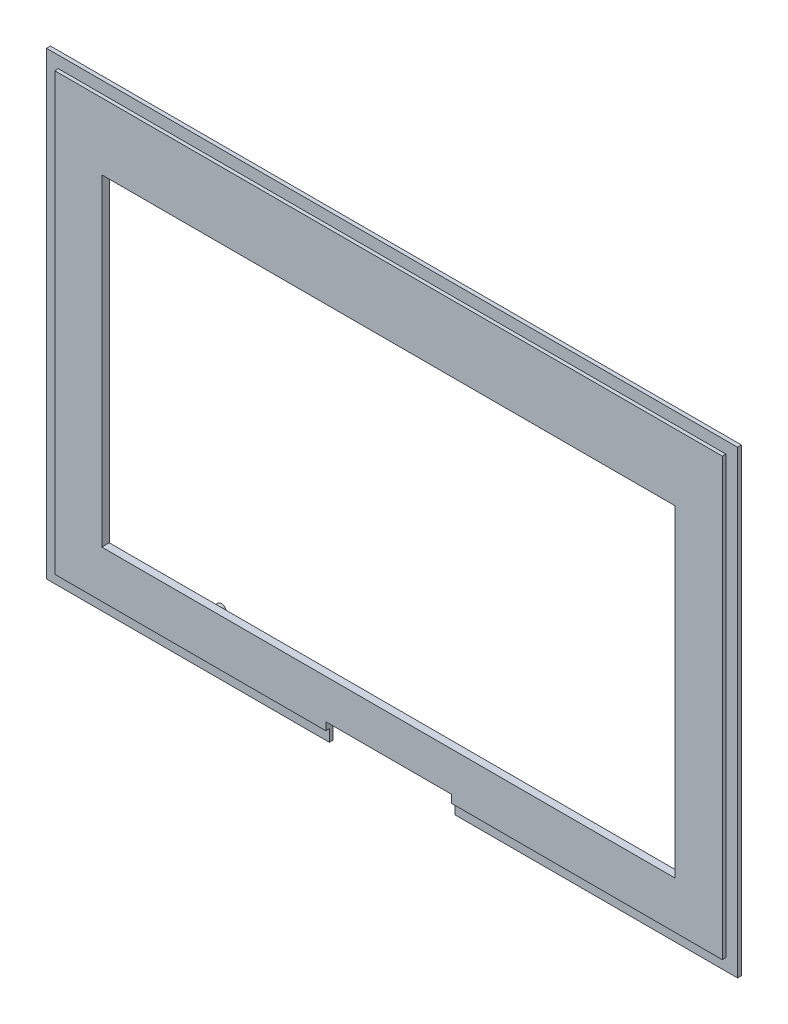
ISO-10303-21;
HEADER;
FILE_DESCRIPTION(('STEP AP214'),'2;1');
FILE_NAME('part.step','',(''),(''),'','','');
FILE_SCHEMA(('AUTOMOTIVE_DESIGN { 1 0 10303 214 1 1 1 1 }'));
ENDSEC;
DATA;
#1=APPLICATION_CONTEXT('core data for automotive mechanical design processes');
#2=APPLICATION_PROTOCOL_DEFINITION('international standard','automotive_design',2000,#1);
#3=PRODUCT_CONTEXT('',#1,'mechanical');
#4=PRODUCT('Part','Part','',(#3));
#5=PRODUCT_RELATED_PRODUCT_CATEGORY('part','',(#4));
#6=PRODUCT_DEFINITION_FORMATION('','',#4);
#7=PRODUCT_DEFINITION_CONTEXT('part definition',#1,'design');
#8=PRODUCT_DEFINITION('design','',#6,#7);
#9=PRODUCT_DEFINITION_SHAPE('','',#8);
#10=(LENGTH_UNIT() NAMED_UNIT(*) SI_UNIT(.MILLI.,.METRE.));
#11=(NAMED_UNIT(*) PLANE_ANGLE_UNIT() SI_UNIT($,.RADIAN.));
#12=(NAMED_UNIT(*) SI_UNIT($,.STERADIAN.) SOLID_ANGLE_UNIT());
#13=UNCERTAINTY_MEASURE_WITH_UNIT(LENGTH_MEASURE(1.E-05),#10,'distance_accuracy_value','');
#14=(GEOMETRIC_REPRESENTATION_CONTEXT(3) GLOBAL_UNCERTAINTY_ASSIGNED_CONTEXT((#13)) GLOBAL_UNIT_ASSIGNED_CONTEXT((#10,
#11,#12)) REPRESENTATION_CONTEXT('',''));
#15=CARTESIAN_POINT('',(0.,0.,0.));
#16=DIRECTION('',(0.,0.,1.));
#17=DIRECTION('',(1.,0.,0.));
#18=AXIS2_PLACEMENT_3D('',#15,#16,#17);
#19=CARTESIAN_POINT('',(5.90000000000003,6.99999999999999,0.9));
#20=DIRECTION('',(0.,1.,0.));
#21=DIRECTION('',(0.,0.,1.));
#22=AXIS2_PLACEMENT_3D('',#19,#20,#21);
#23=PLANE('',#22);
#24=DIRECTION('',(1.,0.,0.));
#25=VECTOR('',#24,1.);
#26=CARTESIAN_POINT('',(5.90000000000003,6.99999999999999,0.));
#27=LINE('',#26,#25);
#28=CARTESIAN_POINT('',(5.90000000000003,6.99999999999999,0.));
#29=VERTEX_POINT('',#28);
#30=CARTESIAN_POINT('',(75.,6.99999999999999,0.));
#31=VERTEX_POINT('',#30);
#32=EDGE_CURVE('E357',#29,#31,#27,.T.);
#33=ORIENTED_EDGE('',*,*,#32,.T.);
#34=DIRECTION('',(0.,0.,1.));
#35=VECTOR('',#34,1.);
#36=CARTESIAN_POINT('',(75.,6.99999999999999,0.9));
#37=LINE('',#36,#35);
#38=CARTESIAN_POINT('',(75.,6.99999999999999,0.9));
#39=VERTEX_POINT('',#38);
#40=EDGE_CURVE('E300',#31,#39,#37,.T.);
#41=ORIENTED_EDGE('',*,*,#40,.T.);
#42=DIRECTION('',(1.,0.,0.));
#43=VECTOR('',#42,1.);
#44=CARTESIAN_POINT('',(5.90000000000003,6.99999999999999,0.9));
#45=LINE('',#44,#43);
#46=CARTESIAN_POINT('',(5.90000000000003,6.99999999999999,0.9));
#47=VERTEX_POINT('',#46);
#48=EDGE_CURVE('E346',#47,#39,#45,.T.);
#49=ORIENTED_EDGE('',*,*,#48,.F.);
#50=DIRECTION('',(0.,0.,-1.));
#51=VECTOR('',#50,1.);
#52=CARTESIAN_POINT('',(5.90000000000003,6.99999999999999,0.9));
#53=LINE('',#52,#51);
#54=EDGE_CURVE('E366',#47,#29,#53,.T.);
#55=ORIENTED_EDGE('',*,*,#54,.T.);
#56=EDGE_LOOP('',(#33,#41,#49,#55));
#57=FACE_BOUND('',#56,.T.);
#58=ADVANCED_FACE('F34',(#57),#23,.F.);
#59=CARTESIAN_POINT('',(179.1,3.99999999999999,-1.));
#60=DIRECTION('',(0.,1.,0.));
#61=DIRECTION('',(0.,0.,1.));
#62=AXIS2_PLACEMENT_3D('',#59,#60,#61);
#63=PLANE('',#62);
#64=DIRECTION('',(-1.,0.,0.));
#65=VECTOR('',#64,1.);
#66=CARTESIAN_POINT('',(179.1,3.99999999999999,-1.));
#67=LINE('',#66,#65);
#68=CARTESIAN_POINT('',(75.,3.99999999999999,-0.999999999999994));
#69=VERTEX_POINT('',#68);
#70=CARTESIAN_POINT('',(2.89999999999999,3.99999999999999,-1.));
#71=VERTEX_POINT('',#70);
#72=EDGE_CURVE('E307',#69,#71,#67,.T.);
#73=ORIENTED_EDGE('',*,*,#72,.F.);
#74=DIRECTION('',(0.,0.,-1.));
#75=VECTOR('',#74,1.);
#76=CARTESIAN_POINT('',(75.,3.99999999999999,-0.999999999999994));
#77=LINE('',#76,#75);
#78=CARTESIAN_POINT('',(75.,3.99999999999999,0.));
#79=VERTEX_POINT('',#78);
#80=EDGE_CURVE('E264',#79,#69,#77,.T.);
#81=ORIENTED_EDGE('',*,*,#80,.F.);
#82=DIRECTION('',(-1.,0.,0.));
#83=VECTOR('',#82,1.);
#84=CARTESIAN_POINT('',(179.1,3.99999999999999,0.));
#85=LINE('',#84,#83);
#86=CARTESIAN_POINT('',(2.89999999999999,3.99999999999999,0.));
#87=VERTEX_POINT('',#86);
#88=EDGE_CURVE('E319',#79,#87,#85,.T.);
#89=ORIENTED_EDGE('',*,*,#88,.T.);
#90=DIRECTION('',(0.,0.,1.));
#91=VECTOR('',#90,1.);
#92=CARTESIAN_POINT('',(2.89999999999999,3.99999999999999,-1.));
#93=LINE('',#92,#91);
#94=EDGE_CURVE('E331',#71,#87,#93,.T.);
#95=ORIENTED_EDGE('',*,*,#94,.F.);
#96=EDGE_LOOP('',(#73,#81,#89,#95));
#97=FACE_BOUND('',#96,.T.);
#98=ADVANCED_FACE('F397',(#97),#63,.F.);
#99=CARTESIAN_POINT('',(5.90000000000001,118.2,0.9));
#100=DIRECTION('',(0.,1.,0.));
#101=DIRECTION('',(-1.,0.,0.));
#102=AXIS2_PLACEMENT_3D('',#99,#100,#101);
#103=PLANE('',#102);
#104=DIRECTION('',(1.,0.,0.));
#105=VECTOR('',#104,1.);
#106=CARTESIAN_POINT('',(5.90000000000001,118.2,0.));
#107=LINE('',#106,#105);
#108=CARTESIAN_POINT('',(5.90000000000001,118.2,0.));
#109=VERTEX_POINT('',#108);
#110=CARTESIAN_POINT('',(176.1,118.2,0.));
#111=VERTEX_POINT('',#110);
#112=EDGE_CURVE('E337',#109,#111,#107,.T.);
#113=ORIENTED_EDGE('',*,*,#112,.F.);
#114=DIRECTION('',(0.,0.,-1.));
#115=VECTOR('',#114,1.);
#116=CARTESIAN_POINT('',(5.90000000000001,118.2,0.9));
#117=LINE('',#116,#115);
#118=CARTESIAN_POINT('',(5.90000000000001,118.2,0.9));
#119=VERTEX_POINT('',#118);
#120=EDGE_CURVE('E362',#119,#109,#117,.T.);
#121=ORIENTED_EDGE('',*,*,#120,.F.);
#122=DIRECTION('',(1.,0.,0.));
#123=VECTOR('',#122,1.);
#124=CARTESIAN_POINT('',(5.90000000000001,118.2,0.9));
#125=LINE('',#124,#123);
#126=CARTESIAN_POINT('',(176.1,118.2,0.9));
#127=VERTEX_POINT('',#126);
#128=EDGE_CURVE('E338',#119,#127,#125,.T.);
#129=ORIENTED_EDGE('',*,*,#128,.T.);
#130=DIRECTION('',(0.,0.,-1.));
#131=VECTOR('',#130,1.);
#132=CARTESIAN_POINT('',(176.1,118.2,0.9));
#133=LINE('',#132,#131);
#134=EDGE_CURVE('E351',#127,#111,#133,.T.);
#135=ORIENTED_EDGE('',*,*,#134,.T.);
#136=EDGE_LOOP('',(#113,#121,#129,#135));
#137=FACE_BOUND('',#136,.T.);
#138=ADVANCED_FACE('F36',(#137),#103,.T.);
#139=CARTESIAN_POINT('',(5.90000000000001,118.2,0.9));
#140=DIRECTION('',(1.,0.,0.));
#141=DIRECTION('',(0.,1.,0.));
#142=AXIS2_PLACEMENT_3D('',#139,#140,#141);
#143=PLANE('',#142);
#144=DIRECTION('',(0.,-1.,0.));
#145=VECTOR('',#144,1.);
#146=CARTESIAN_POINT('',(5.90000000000001,118.2,0.));
#147=LINE('',#146,#145);
#148=EDGE_CURVE('E342',#109,#29,#147,.T.);
#149=ORIENTED_EDGE('',*,*,#148,.T.);
#150=ORIENTED_EDGE('',*,*,#54,.F.);
#151=DIRECTION('',(0.,-1.,0.));
#152=VECTOR('',#151,1.);
#153=CARTESIAN_POINT('',(5.90000000000001,118.2,0.9));
#154=LINE('',#153,#152);
#155=EDGE_CURVE('E349',#119,#47,#154,.T.);
#156=ORIENTED_EDGE('',*,*,#155,.F.);
#157=ORIENTED_EDGE('',*,*,#120,.T.);
#158=EDGE_LOOP('',(#149,#150,#156,#157));
#159=FACE_BOUND('',#158,.T.);
#160=ADVANCED_FACE('F410',(#159),#143,.F.);
#161=CARTESIAN_POINT('',(107.,6.99999999999999,0.900000000000006));
#162=VERTEX_POINT('',#161);
#163=CARTESIAN_POINT('',(176.1,6.99999999999999,0.9));
#164=VERTEX_POINT('',#163);
#165=EDGE_CURVE('E345',#162,#164,#45,.T.);
#166=ORIENTED_EDGE('',*,*,#165,.F.);
#167=DIRECTION('',(0.,0.,-1.));
#168=VECTOR('',#167,1.);
#169=CARTESIAN_POINT('',(107.,6.99999999999999,0.9));
#170=LINE('',#169,#168);
#171=CARTESIAN_POINT('',(107.,6.99999999999999,0.));
#172=VERTEX_POINT('',#171);
#173=EDGE_CURVE('E294',#162,#172,#170,.T.);
#174=ORIENTED_EDGE('',*,*,#173,.T.);
#175=CARTESIAN_POINT('',(176.1,6.99999999999999,0.));
#176=VERTEX_POINT('',#175);
#177=EDGE_CURVE('E356',#172,#176,#27,.T.);
#178=ORIENTED_EDGE('',*,*,#177,.T.);
#179=DIRECTION('',(0.,0.,-1.));
#180=VECTOR('',#179,1.);
#181=CARTESIAN_POINT('',(176.1,6.99999999999999,0.9));
#182=LINE('',#181,#180);
#183=EDGE_CURVE('E369',#164,#176,#182,.T.);
#184=ORIENTED_EDGE('',*,*,#183,.F.);
#185=EDGE_LOOP('',(#166,#174,#178,#184));
#186=FACE_BOUND('',#185,.T.);
#187=ADVANCED_FACE('F400',(#186),#23,.F.);
#188=CARTESIAN_POINT('',(176.1,118.2,0.9));
#189=DIRECTION('',(1.,0.,0.));
#190=DIRECTION('',(0.,0.,-1.));
#191=AXIS2_PLACEMENT_3D('',#188,#189,#190);
#192=PLANE('',#191);
#193=DIRECTION('',(0.,-1.,0.));
#194=VECTOR('',#193,1.);
#195=CARTESIAN_POINT('',(176.1,118.2,0.));
#196=LINE('',#195,#194);
#197=EDGE_CURVE('E353',#111,#176,#196,.T.);
#198=ORIENTED_EDGE('',*,*,#197,.F.);
#199=ORIENTED_EDGE('',*,*,#134,.F.);
#200=DIRECTION('',(0.,-1.,0.));
#201=VECTOR('',#200,1.);
#202=CARTESIAN_POINT('',(176.1,118.2,0.9));
#203=LINE('',#202,#201);
#204=EDGE_CURVE('E341',#127,#164,#203,.T.);
#205=ORIENTED_EDGE('',*,*,#204,.T.);
#206=ORIENTED_EDGE('',*,*,#183,.T.);
#207=EDGE_LOOP('',(#198,#199,#205,#206));
#208=FACE_BOUND('',#207,.T.);
#209=ADVANCED_FACE('F409',(#208),#192,.T.);
#210=CARTESIAN_POINT('',(0.,0.,0.9));
#211=DIRECTION('',(0.,0.,-1.));
#212=DIRECTION('',(-1.,0.,0.));
#213=AXIS2_PLACEMENT_3D('',#210,#211,#212);
#214=PLANE('',#213);
#215=DIRECTION('',(1.,0.,0.));
#216=VECTOR('',#215,1.);
#217=CARTESIAN_POINT('',(17.9,19.,0.9));
#218=LINE('',#217,#216);
#219=CARTESIAN_POINT('',(17.9,19.,0.9));
#220=VERTEX_POINT('',#219);
#221=CARTESIAN_POINT('',(164.1,19.,0.9));
#222=VERTEX_POINT('',#221);
#223=EDGE_CURVE('E194',#220,#222,#218,.T.);
#224=ORIENTED_EDGE('',*,*,#223,.F.);
#225=DIRECTION('',(0.,-1.,0.));
#226=VECTOR('',#225,1.);
#227=CARTESIAN_POINT('',(17.9,101.2,0.9));
#228=LINE('',#227,#226);
#229=CARTESIAN_POINT('',(17.9,101.2,0.9));
#230=VERTEX_POINT('',#229);
#231=EDGE_CURVE('E49',#230,#220,#228,.T.);
#232=ORIENTED_EDGE('',*,*,#231,.F.);
#233=DIRECTION('',(-1.,0.,0.));
#234=VECTOR('',#233,1.);
#235=CARTESIAN_POINT('',(17.9,101.2,0.9));
#236=LINE('',#235,#234);
#237=CARTESIAN_POINT('',(164.1,101.2,0.9));
#238=VERTEX_POINT('',#237);
#239=EDGE_CURVE('E201',#238,#230,#236,.T.);
#240=ORIENTED_EDGE('',*,*,#239,.F.);
#241=DIRECTION('',(0.,1.,0.));
#242=VECTOR('',#241,1.);
#243=CARTESIAN_POINT('',(164.1,101.2,0.9));
#244=LINE('',#243,#242);
#245=EDGE_CURVE('E185',#222,#238,#244,.T.);
#246=ORIENTED_EDGE('',*,*,#245,.F.);
#247=EDGE_LOOP('',(#224,#232,#240,#246));
#248=FACE_BOUND('',#247,.T.);
#249=ORIENTED_EDGE('',*,*,#48,.T.);
#250=DIRECTION('',(0.,-1.,0.));
#251=VECTOR('',#250,1.);
#252=CARTESIAN_POINT('',(75.,8.99999999999999,0.9));
#253=LINE('',#252,#251);
#254=CARTESIAN_POINT('',(75.,8.99999999999999,0.9));
#255=VERTEX_POINT('',#254);
#256=EDGE_CURVE('E282',#255,#39,#253,.T.);
#257=ORIENTED_EDGE('',*,*,#256,.F.);
#258=DIRECTION('',(-1.,0.,0.));
#259=VECTOR('',#258,1.);
#260=CARTESIAN_POINT('',(75.,8.99999999999999,0.9));
#261=LINE('',#260,#259);
#262=CARTESIAN_POINT('',(107.,8.99999999999999,0.900000000000006));
#263=VERTEX_POINT('',#262);
#264=EDGE_CURVE('E276',#263,#255,#261,.T.);
#265=ORIENTED_EDGE('',*,*,#264,.F.);
#266=DIRECTION('',(0.,-1.,0.));
#267=VECTOR('',#266,1.);
#268=CARTESIAN_POINT('',(107.,8.99999999999999,0.900000000000006));
#269=LINE('',#268,#267);
#270=EDGE_CURVE('E285',#263,#162,#269,.T.);
#271=ORIENTED_EDGE('',*,*,#270,.T.);
#272=ORIENTED_EDGE('',*,*,#165,.T.);
#273=ORIENTED_EDGE('',*,*,#204,.F.);
#274=ORIENTED_EDGE('',*,*,#128,.F.);
#275=ORIENTED_EDGE('',*,*,#155,.T.);
#276=EDGE_LOOP('',(#249,#257,#265,#271,#272,#273,#274,#275));
#277=FACE_BOUND('',#276,.T.);
#278=ADVANCED_FACE('F198',(#248,#277),#214,.F.);
#279=CARTESIAN_POINT('',(0.,0.,0.));
#280=DIRECTION('',(0.,0.,-1.));
#281=DIRECTION('',(-1.,0.,0.));
#282=AXIS2_PLACEMENT_3D('',#279,#280,#281);
#283=PLANE('',#282);
#284=ORIENTED_EDGE('',*,*,#88,.F.);
#285=DIRECTION('',(0.,1.,0.));
#286=VECTOR('',#285,1.);
#287=CARTESIAN_POINT('',(75.,0.,0.));
#288=LINE('',#287,#286);
#289=EDGE_CURVE('E297',#79,#31,#288,.T.);
#290=ORIENTED_EDGE('',*,*,#289,.T.);
#291=ORIENTED_EDGE('',*,*,#32,.F.);
#292=ORIENTED_EDGE('',*,*,#148,.F.);
#293=ORIENTED_EDGE('',*,*,#112,.T.);
#294=ORIENTED_EDGE('',*,*,#197,.T.);
#295=ORIENTED_EDGE('',*,*,#177,.F.);
#296=DIRECTION('',(0.,-1.,0.));
#297=VECTOR('',#296,1.);
#298=CARTESIAN_POINT('',(107.,0.,0.));
#299=LINE('',#298,#297);
#300=CARTESIAN_POINT('',(107.,3.99999999999999,0.));
#301=VERTEX_POINT('',#300);
#302=EDGE_CURVE('E284',#172,#301,#299,.T.);
#303=ORIENTED_EDGE('',*,*,#302,.T.);
#304=CARTESIAN_POINT('',(179.1,3.99999999999999,0.));
#305=VERTEX_POINT('',#304);
#306=EDGE_CURVE('E320',#305,#301,#85,.T.);
#307=ORIENTED_EDGE('',*,*,#306,.F.);
#308=DIRECTION('',(0.,-1.,0.));
#309=VECTOR('',#308,1.);
#310=CARTESIAN_POINT('',(179.1,121.2,0.));
#311=LINE('',#310,#309);
#312=CARTESIAN_POINT('',(179.1,121.2,0.));
#313=VERTEX_POINT('',#312);
#314=EDGE_CURVE('E303',#313,#305,#311,.T.);
#315=ORIENTED_EDGE('',*,*,#314,.F.);
#316=DIRECTION('',(1.,0.,0.));
#317=VECTOR('',#316,1.);
#318=CARTESIAN_POINT('',(179.1,121.2,0.));
#319=LINE('',#318,#317);
#320=CARTESIAN_POINT('',(2.90000000000001,121.2,0.));
#321=VERTEX_POINT('',#320);
#322=EDGE_CURVE('E308',#321,#313,#319,.T.);
#323=ORIENTED_EDGE('',*,*,#322,.F.);
#324=DIRECTION('',(0.,1.,0.));
#325=VECTOR('',#324,1.);
#326=CARTESIAN_POINT('',(2.90000000000001,121.2,0.));
#327=LINE('',#326,#325);
#328=EDGE_CURVE('E323',#87,#321,#327,.T.);
#329=ORIENTED_EDGE('',*,*,#328,.F.);
#330=EDGE_LOOP('',(#284,#290,#291,#292,#293,#294,#295,#303,#307,#315,#323,#329));
#331=FACE_BOUND('',#330,.T.);
#332=ADVANCED_FACE('F439',(#331),#283,.F.);
#333=CARTESIAN_POINT('',(179.1,121.2,-1.));
#334=DIRECTION('',(-1.,0.,0.));
#335=DIRECTION('',(0.,-1.,0.));
#336=AXIS2_PLACEMENT_3D('',#333,#334,#335);
#337=PLANE('',#336);
#338=ORIENTED_EDGE('',*,*,#314,.T.);
#339=DIRECTION('',(0.,0.,1.));
#340=VECTOR('',#339,1.);
#341=CARTESIAN_POINT('',(179.1,3.99999999999999,-1.));
#342=LINE('',#341,#340);
#343=CARTESIAN_POINT('',(179.1,3.99999999999999,-1.));
#344=VERTEX_POINT('',#343);
#345=EDGE_CURVE('E334',#344,#305,#342,.T.);
#346=ORIENTED_EDGE('',*,*,#345,.F.);
#347=DIRECTION('',(0.,-1.,0.));
#348=VECTOR('',#347,1.);
#349=CARTESIAN_POINT('',(179.1,121.2,-1.));
#350=LINE('',#349,#348);
#351=CARTESIAN_POINT('',(179.1,121.2,-1.));
#352=VERTEX_POINT('',#351);
#353=EDGE_CURVE('E304',#352,#344,#350,.T.);
#354=ORIENTED_EDGE('',*,*,#353,.F.);
#355=DIRECTION('',(0.,0.,1.));
#356=VECTOR('',#355,1.);
#357=CARTESIAN_POINT('',(179.1,121.2,-1.));
#358=LINE('',#357,#356);
#359=EDGE_CURVE('E316',#352,#313,#358,.T.);
#360=ORIENTED_EDGE('',*,*,#359,.T.);
#361=EDGE_LOOP('',(#338,#346,#354,#360));
#362=FACE_BOUND('',#361,.T.);
#363=ADVANCED_FACE('F463',(#362),#337,.F.);
#364=ORIENTED_EDGE('',*,*,#306,.T.);
#365=DIRECTION('',(0.,0.,1.));
#366=VECTOR('',#365,1.);
#367=CARTESIAN_POINT('',(107.,3.99999999999999,-0.999999999999986));
#368=LINE('',#367,#366);
#369=CARTESIAN_POINT('',(107.,3.99999999999999,-0.999999999999986));
#370=VERTEX_POINT('',#369);
#371=EDGE_CURVE('E270',#370,#301,#368,.T.);
#372=ORIENTED_EDGE('',*,*,#371,.F.);
#373=EDGE_CURVE('E309',#344,#370,#67,.T.);
#374=ORIENTED_EDGE('',*,*,#373,.F.);
#375=ORIENTED_EDGE('',*,*,#345,.T.);
#376=EDGE_LOOP('',(#364,#372,#374,#375));
#377=FACE_BOUND('',#376,.T.);
#378=ADVANCED_FACE('F406',(#377),#63,.F.);
#379=CARTESIAN_POINT('',(2.90000000000001,121.2,-1.));
#380=DIRECTION('',(1.,0.,0.));
#381=DIRECTION('',(0.,1.,0.));
#382=AXIS2_PLACEMENT_3D('',#379,#380,#381);
#383=PLANE('',#382);
#384=ORIENTED_EDGE('',*,*,#328,.T.);
#385=DIRECTION('',(0.,0.,1.));
#386=VECTOR('',#385,1.);
#387=CARTESIAN_POINT('',(2.90000000000001,121.2,-1.));
#388=LINE('',#387,#386);
#389=CARTESIAN_POINT('',(2.90000000000001,121.2,-1.));
#390=VERTEX_POINT('',#389);
#391=EDGE_CURVE('E328',#390,#321,#388,.T.);
#392=ORIENTED_EDGE('',*,*,#391,.F.);
#393=DIRECTION('',(0.,1.,0.));
#394=VECTOR('',#393,1.);
#395=CARTESIAN_POINT('',(2.90000000000001,121.2,-1.));
#396=LINE('',#395,#394);
#397=EDGE_CURVE('E312',#71,#390,#396,.T.);
#398=ORIENTED_EDGE('',*,*,#397,.F.);
#399=ORIENTED_EDGE('',*,*,#94,.T.);
#400=EDGE_LOOP('',(#384,#392,#398,#399));
#401=FACE_BOUND('',#400,.T.);
#402=ADVANCED_FACE('F455',(#401),#383,.F.);
#403=CARTESIAN_POINT('',(179.1,121.2,-1.));
#404=DIRECTION('',(0.,-1.,0.));
#405=DIRECTION('',(0.,0.,-1.));
#406=AXIS2_PLACEMENT_3D('',#403,#404,#405);
#407=PLANE('',#406);
#408=ORIENTED_EDGE('',*,*,#322,.T.);
#409=ORIENTED_EDGE('',*,*,#359,.F.);
#410=DIRECTION('',(1.,0.,0.));
#411=VECTOR('',#410,1.);
#412=CARTESIAN_POINT('',(179.1,121.2,-1.));
#413=LINE('',#412,#411);
#414=EDGE_CURVE('E314',#390,#352,#413,.T.);
#415=ORIENTED_EDGE('',*,*,#414,.F.);
#416=ORIENTED_EDGE('',*,*,#391,.T.);
#417=EDGE_LOOP('',(#408,#409,#415,#416));
#418=FACE_BOUND('',#417,.T.);
#419=ADVANCED_FACE('F461',(#418),#407,.F.);
#420=CARTESIAN_POINT('',(0.,0.,-1.));
#421=DIRECTION('',(0.,0.,-1.));
#422=DIRECTION('',(-1.,0.,0.));
#423=AXIS2_PLACEMENT_3D('',#420,#421,#422);
#424=PLANE('',#423);
#425=DIRECTION('',(0.,1.,0.));
#426=VECTOR('',#425,1.);
#427=CARTESIAN_POINT('',(17.9,0.,-1.));
#428=LINE('',#427,#426);
#429=CARTESIAN_POINT('',(17.9,19.,-1.));
#430=VERTEX_POINT('',#429);
#431=CARTESIAN_POINT('',(17.9,101.2,-1.));
#432=VERTEX_POINT('',#431);
#433=EDGE_CURVE('E11',#430,#432,#428,.T.);
#434=ORIENTED_EDGE('',*,*,#433,.F.);
#435=DIRECTION('',(-1.,0.,0.));
#436=VECTOR('',#435,1.);
#437=CARTESIAN_POINT('',(0.,19.,-1.));
#438=LINE('',#437,#436);
#439=CARTESIAN_POINT('',(164.1,19.,-1.));
#440=VERTEX_POINT('',#439);
#441=EDGE_CURVE('E365',#440,#430,#438,.T.);
#442=ORIENTED_EDGE('',*,*,#441,.F.);
#443=DIRECTION('',(0.,-1.,0.));
#444=VECTOR('',#443,1.);
#445=CARTESIAN_POINT('',(164.1,0.,-1.));
#446=LINE('',#445,#444);
#447=CARTESIAN_POINT('',(164.1,101.2,-1.));
#448=VERTEX_POINT('',#447);
#449=EDGE_CURVE('E188',#448,#440,#446,.T.);
#450=ORIENTED_EDGE('',*,*,#449,.F.);
#451=DIRECTION('',(1.,0.,0.));
#452=VECTOR('',#451,1.);
#453=CARTESIAN_POINT('',(0.,101.2,-1.));
#454=LINE('',#453,#452);
#455=EDGE_CURVE('E42',#432,#448,#454,.T.);
#456=ORIENTED_EDGE('',*,*,#455,.F.);
#457=EDGE_LOOP('',(#434,#442,#450,#456));
#458=FACE_BOUND('',#457,.T.);
#459=DIRECTION('',(0.,-1.,0.));
#460=VECTOR('',#459,1.);
#461=CARTESIAN_POINT('',(58.55,108.45,-1.));
#462=LINE('',#461,#460);
#463=CARTESIAN_POINT('',(58.55,108.45,-1.));
#464=VERTEX_POINT('',#463);
#465=CARTESIAN_POINT('',(58.55,104.45,-1.));
#466=VERTEX_POINT('',#465);
#467=EDGE_CURVE('E208',#464,#466,#462,.T.);
#468=ORIENTED_EDGE('',*,*,#467,.F.);
#469=DIRECTION('',(1.,0.,0.));
#470=VECTOR('',#469,1.);
#471=CARTESIAN_POINT('',(58.55,108.45,-1.));
#472=LINE('',#471,#470);
#473=CARTESIAN_POINT('',(45.55,108.45,-1.));
#474=VERTEX_POINT('',#473);
#475=EDGE_CURVE('E215',#474,#464,#472,.T.);
#476=ORIENTED_EDGE('',*,*,#475,.F.);
#477=DIRECTION('',(0.,1.,0.));
#478=VECTOR('',#477,1.);
#479=CARTESIAN_POINT('',(45.55,108.45,-1.));
#480=LINE('',#479,#478);
#481=CARTESIAN_POINT('',(45.55,104.45,-1.));
#482=VERTEX_POINT('',#481);
#483=EDGE_CURVE('E229',#482,#474,#480,.T.);
#484=ORIENTED_EDGE('',*,*,#483,.F.);
#485=DIRECTION('',(-1.,0.,0.));
#486=VECTOR('',#485,1.);
#487=CARTESIAN_POINT('',(58.55,104.45,-1.));
#488=LINE('',#487,#486);
#489=EDGE_CURVE('E226',#466,#482,#488,.T.);
#490=ORIENTED_EDGE('',*,*,#489,.F.);
#491=EDGE_LOOP('',(#468,#476,#484,#490));
#492=FACE_BOUND('',#491,.T.);
#493=CARTESIAN_POINT('',(44.,16.15,-1.));
#494=DIRECTION('',(0.,0.,-1.));
#495=DIRECTION('',(-1.,0.,0.));
#496=AXIS2_PLACEMENT_3D('',#493,#494,#495);
#497=CIRCLE('',#496,1.25);
#498=CARTESIAN_POINT('',(42.75,16.15,-1.));
#499=VERTEX_POINT('',#498);
#500=EDGE_CURVE('E236',#499,#499,#497,.T.);
#501=ORIENTED_EDGE('',*,*,#500,.F.);
#502=EDGE_LOOP('',(#501));
#503=FACE_BOUND('',#502,.T.);
#504=CARTESIAN_POINT('',(43.3,106.45,-1.));
#505=DIRECTION('',(0.,0.,-1.));
#506=DIRECTION('',(-1.,0.,0.));
#507=AXIS2_PLACEMENT_3D('',#504,#505,#506);
#508=CIRCLE('',#507,1.25);
#509=CARTESIAN_POINT('',(42.05,106.45,-1.));
#510=VERTEX_POINT('',#509);
#511=EDGE_CURVE('E246',#510,#510,#508,.T.);
#512=ORIENTED_EDGE('',*,*,#511,.F.);
#513=EDGE_LOOP('',(#512));
#514=FACE_BOUND('',#513,.T.);
#515=CARTESIAN_POINT('',(108.3,106.45,-1.));
#516=DIRECTION('',(0.,0.,-1.));
#517=DIRECTION('',(-1.,0.,0.));
#518=AXIS2_PLACEMENT_3D('',#515,#516,#517);
#519=CIRCLE('',#518,1.25);
#520=CARTESIAN_POINT('',(107.05,106.45,-1.));
#521=VERTEX_POINT('',#520);
#522=EDGE_CURVE('E252',#521,#521,#519,.T.);
#523=ORIENTED_EDGE('',*,*,#522,.F.);
#524=EDGE_LOOP('',(#523));
#525=FACE_BOUND('',#524,.T.);
#526=CARTESIAN_POINT('',(108.3,14.75,-1.));
#527=DIRECTION('',(0.,0.,-1.));
#528=DIRECTION('',(-1.,0.,0.));
#529=AXIS2_PLACEMENT_3D('',#526,#527,#528);
#530=CIRCLE('',#529,1.25);
#531=CARTESIAN_POINT('',(107.05,14.75,-1.));
#532=VERTEX_POINT('',#531);
#533=EDGE_CURVE('E258',#532,#532,#530,.T.);
#534=ORIENTED_EDGE('',*,*,#533,.F.);
#535=EDGE_LOOP('',(#534));
#536=FACE_BOUND('',#535,.T.);
#537=DIRECTION('',(0.,-1.,0.));
#538=VECTOR('',#537,1.);
#539=CARTESIAN_POINT('',(75.,8.99999999999999,-0.999999999999994));
#540=LINE('',#539,#538);
#541=CARTESIAN_POINT('',(75.,8.99999999999999,-1.));
#542=VERTEX_POINT('',#541);
#543=EDGE_CURVE('E279',#542,#69,#540,.T.);
#544=ORIENTED_EDGE('',*,*,#543,.T.);
#545=ORIENTED_EDGE('',*,*,#72,.T.);
#546=ORIENTED_EDGE('',*,*,#397,.T.);
#547=ORIENTED_EDGE('',*,*,#414,.T.);
#548=ORIENTED_EDGE('',*,*,#353,.T.);
#549=ORIENTED_EDGE('',*,*,#373,.T.);
#550=DIRECTION('',(0.,-1.,0.));
#551=VECTOR('',#550,1.);
#552=CARTESIAN_POINT('',(107.,8.99999999999999,-0.999999999999986));
#553=LINE('',#552,#551);
#554=CARTESIAN_POINT('',(107.,8.99999999999999,-0.999999999999986));
#555=VERTEX_POINT('',#554);
#556=EDGE_CURVE('E288',#555,#370,#553,.T.);
#557=ORIENTED_EDGE('',*,*,#556,.F.);
#558=DIRECTION('',(1.,0.,0.));
#559=VECTOR('',#558,1.);
#560=CARTESIAN_POINT('',(75.,8.99999999999999,-0.999999999999994));
#561=LINE('',#560,#559);
#562=EDGE_CURVE('E269',#542,#555,#561,.T.);
#563=ORIENTED_EDGE('',*,*,#562,.F.);
#564=EDGE_LOOP('',(#544,#545,#546,#547,#548,#549,#557,#563));
#565=FACE_BOUND('',#564,.T.);
#566=ADVANCED_FACE('F381',(#458,#492,#503,#514,#525,#536,#565),#424,.T.);
#567=CARTESIAN_POINT('',(75.,8.99999999999999,-0.999999999999994));
#568=DIRECTION('',(-1.,0.,0.));
#569=DIRECTION('',(0.,0.,1.));
#570=AXIS2_PLACEMENT_3D('',#567,#568,#569);
#571=PLANE('',#570);
#572=ORIENTED_EDGE('',*,*,#289,.F.);
#573=ORIENTED_EDGE('',*,*,#80,.T.);
#574=ORIENTED_EDGE('',*,*,#543,.F.);
#575=DIRECTION('',(0.,0.,-1.));
#576=VECTOR('',#575,1.);
#577=CARTESIAN_POINT('',(75.,8.99999999999999,-0.999999999999994));
#578=LINE('',#577,#576);
#579=EDGE_CURVE('E267',#255,#542,#578,.T.);
#580=ORIENTED_EDGE('',*,*,#579,.F.);
#581=ORIENTED_EDGE('',*,*,#256,.T.);
#582=ORIENTED_EDGE('',*,*,#40,.F.);
#583=EDGE_LOOP('',(#572,#573,#574,#580,#581,#582));
#584=FACE_BOUND('',#583,.T.);
#585=ADVANCED_FACE('F448',(#584),#571,.F.);
#586=CARTESIAN_POINT('',(107.,8.99999999999999,-0.999999999999986));
#587=DIRECTION('',(1.,0.,0.));
#588=DIRECTION('',(0.,0.,-1.));
#589=AXIS2_PLACEMENT_3D('',#586,#587,#588);
#590=PLANE('',#589);
#591=ORIENTED_EDGE('',*,*,#270,.F.);
#592=DIRECTION('',(0.,0.,1.));
#593=VECTOR('',#592,1.);
#594=CARTESIAN_POINT('',(107.,8.99999999999999,-0.999999999999986));
#595=LINE('',#594,#593);
#596=EDGE_CURVE('E273',#555,#263,#595,.T.);
#597=ORIENTED_EDGE('',*,*,#596,.F.);
#598=ORIENTED_EDGE('',*,*,#556,.T.);
#599=ORIENTED_EDGE('',*,*,#371,.T.);
#600=ORIENTED_EDGE('',*,*,#302,.F.);
#601=ORIENTED_EDGE('',*,*,#173,.F.);
#602=EDGE_LOOP('',(#591,#597,#598,#599,#600,#601));
#603=FACE_BOUND('',#602,.T.);
#604=ADVANCED_FACE('F426',(#603),#590,.F.);
#605=CARTESIAN_POINT('',(0.,8.99999999999999,0.));
#606=DIRECTION('',(0.,1.,0.));
#607=DIRECTION('',(0.,0.,1.));
#608=AXIS2_PLACEMENT_3D('',#605,#606,#607);
#609=PLANE('',#608);
#610=ORIENTED_EDGE('',*,*,#579,.T.);
#611=ORIENTED_EDGE('',*,*,#562,.T.);
#612=ORIENTED_EDGE('',*,*,#596,.T.);
#613=ORIENTED_EDGE('',*,*,#264,.T.);
#614=EDGE_LOOP('',(#610,#611,#612,#613));
#615=FACE_BOUND('',#614,.T.);
#616=ADVANCED_FACE('F428',(#615),#609,.F.);
#617=CARTESIAN_POINT('',(108.3,14.75,-3.5));
#618=DIRECTION('',(0.,0.,1.));
#619=DIRECTION('',(1.,0.,0.));
#620=AXIS2_PLACEMENT_3D('',#617,#618,#619);
#621=CYLINDRICAL_SURFACE('',#620,1.25);
#622=CARTESIAN_POINT('',(108.3,14.75,-3.5));
#623=DIRECTION('',(0.,0.,-1.));
#624=DIRECTION('',(-1.,0.,0.));
#625=AXIS2_PLACEMENT_3D('',#622,#623,#624);
#626=CIRCLE('',#625,1.25);
#627=CARTESIAN_POINT('',(107.05,14.75,-3.5));
#628=VERTEX_POINT('',#627);
#629=EDGE_CURVE('E261',#628,#628,#626,.T.);
#630=ORIENTED_EDGE('',*,*,#629,.F.);
#631=EDGE_LOOP('',(#630));
#632=FACE_BOUND('',#631,.T.);
#633=ORIENTED_EDGE('',*,*,#533,.T.);
#634=EDGE_LOOP('',(#633));
#635=FACE_BOUND('',#634,.T.);
#636=ADVANCED_FACE('F523',(#632,#635),#621,.T.);
#637=CARTESIAN_POINT('',(108.3,14.75,-3.5));
#638=DIRECTION('',(0.,0.,-1.));
#639=DIRECTION('',(-1.,0.,0.));
#640=AXIS2_PLACEMENT_3D('',#637,#638,#639);
#641=PLANE('',#640);
#642=ORIENTED_EDGE('',*,*,#629,.T.);
#643=EDGE_LOOP('',(#642));
#644=FACE_BOUND('',#643,.T.);
#645=ADVANCED_FACE('F532',(#644),#641,.T.);
#646=CARTESIAN_POINT('',(108.3,106.45,-3.5));
#647=DIRECTION('',(0.,0.,1.));
#648=DIRECTION('',(1.,0.,0.));
#649=AXIS2_PLACEMENT_3D('',#646,#647,#648);
#650=CYLINDRICAL_SURFACE('',#649,1.25);
#651=CARTESIAN_POINT('',(108.3,106.45,-3.5));
#652=DIRECTION('',(0.,0.,-1.));
#653=DIRECTION('',(-1.,0.,0.));
#654=AXIS2_PLACEMENT_3D('',#651,#652,#653);
#655=CIRCLE('',#654,1.25);
#656=CARTESIAN_POINT('',(107.05,106.45,-3.5));
#657=VERTEX_POINT('',#656);
#658=EDGE_CURVE('E255',#657,#657,#655,.T.);
#659=ORIENTED_EDGE('',*,*,#658,.F.);
#660=EDGE_LOOP('',(#659));
#661=FACE_BOUND('',#660,.T.);
#662=ORIENTED_EDGE('',*,*,#522,.T.);
#663=EDGE_LOOP('',(#662));
#664=FACE_BOUND('',#663,.T.);
#665=ADVANCED_FACE('F542',(#661,#664),#650,.T.);
#666=CARTESIAN_POINT('',(108.3,106.45,-3.5));
#667=DIRECTION('',(0.,0.,-1.));
#668=DIRECTION('',(-1.,0.,0.));
#669=AXIS2_PLACEMENT_3D('',#666,#667,#668);
#670=PLANE('',#669);
#671=ORIENTED_EDGE('',*,*,#658,.T.);
#672=EDGE_LOOP('',(#671));
#673=FACE_BOUND('',#672,.T.);
#674=ADVANCED_FACE('F552',(#673),#670,.T.);
#675=CARTESIAN_POINT('',(43.3,106.45,-3.5));
#676=DIRECTION('',(0.,0.,1.));
#677=DIRECTION('',(1.,0.,0.));
#678=AXIS2_PLACEMENT_3D('',#675,#676,#677);
#679=CYLINDRICAL_SURFACE('',#678,1.25);
#680=CARTESIAN_POINT('',(43.3,106.45,-3.5));
#681=DIRECTION('',(0.,0.,-1.));
#682=DIRECTION('',(-1.,0.,0.));
#683=AXIS2_PLACEMENT_3D('',#680,#681,#682);
#684=CIRCLE('',#683,1.25);
#685=CARTESIAN_POINT('',(42.05,106.45,-3.5));
#686=VERTEX_POINT('',#685);
#687=EDGE_CURVE('E249',#686,#686,#684,.T.);
#688=ORIENTED_EDGE('',*,*,#687,.F.);
#689=EDGE_LOOP('',(#688));
#690=FACE_BOUND('',#689,.T.);
#691=ORIENTED_EDGE('',*,*,#511,.T.);
#692=EDGE_LOOP('',(#691));
#693=FACE_BOUND('',#692,.T.);
#694=ADVANCED_FACE('F562',(#690,#693),#679,.T.);
#695=CARTESIAN_POINT('',(43.3,106.45,-3.5));
#696=DIRECTION('',(0.,0.,-1.));
#697=DIRECTION('',(-1.,0.,0.));
#698=AXIS2_PLACEMENT_3D('',#695,#696,#697);
#699=PLANE('',#698);
#700=ORIENTED_EDGE('',*,*,#687,.T.);
#701=EDGE_LOOP('',(#700));
#702=FACE_BOUND('',#701,.T.);
#703=ADVANCED_FACE('F572',(#702),#699,.T.);
#704=CARTESIAN_POINT('',(44.,16.15,-3.5));
#705=DIRECTION('',(0.,0.,1.));
#706=DIRECTION('',(1.,0.,0.));
#707=AXIS2_PLACEMENT_3D('',#704,#705,#706);
#708=CYLINDRICAL_SURFACE('',#707,1.25);
#709=CARTESIAN_POINT('',(44.,16.15,-3.5));
#710=DIRECTION('',(0.,0.,-1.));
#711=DIRECTION('',(-1.,0.,0.));
#712=AXIS2_PLACEMENT_3D('',#709,#710,#711);
#713=CIRCLE('',#712,1.25);
#714=CARTESIAN_POINT('',(42.75,16.15,-3.5));
#715=VERTEX_POINT('',#714);
#716=EDGE_CURVE('E243',#715,#715,#713,.T.);
#717=ORIENTED_EDGE('',*,*,#716,.F.);
#718=EDGE_LOOP('',(#717));
#719=FACE_BOUND('',#718,.T.);
#720=ORIENTED_EDGE('',*,*,#500,.T.);
#721=EDGE_LOOP('',(#720));
#722=FACE_BOUND('',#721,.T.);
#723=ADVANCED_FACE('F582',(#719,#722),#708,.T.);
#724=CARTESIAN_POINT('',(44.,16.15,-3.5));
#725=DIRECTION('',(0.,0.,-1.));
#726=DIRECTION('',(-1.,0.,0.));
#727=AXIS2_PLACEMENT_3D('',#724,#725,#726);
#728=PLANE('',#727);
#729=ORIENTED_EDGE('',*,*,#716,.T.);
#730=EDGE_LOOP('',(#729));
#731=FACE_BOUND('',#730,.T.);
#732=ADVANCED_FACE('F592',(#731),#728,.T.);
#733=CARTESIAN_POINT('',(58.55,108.45,0.1));
#734=DIRECTION('',(1.,0.,0.));
#735=DIRECTION('',(0.,0.,-1.));
#736=AXIS2_PLACEMENT_3D('',#733,#734,#735);
#737=PLANE('',#736);
#738=ORIENTED_EDGE('',*,*,#467,.T.);
#739=DIRECTION('',(0.,0.,-1.));
#740=VECTOR('',#739,1.);
#741=CARTESIAN_POINT('',(58.55,104.45,0.1));
#742=LINE('',#741,#740);
#743=CARTESIAN_POINT('',(58.55,104.45,0.1));
#744=VERTEX_POINT('',#743);
#745=EDGE_CURVE('E224',#744,#466,#742,.T.);
#746=ORIENTED_EDGE('',*,*,#745,.F.);
#747=DIRECTION('',(0.,-1.,0.));
#748=VECTOR('',#747,1.);
#749=CARTESIAN_POINT('',(58.55,108.45,0.1));
#750=LINE('',#749,#748);
#751=CARTESIAN_POINT('',(58.55,108.45,0.1));
#752=VERTEX_POINT('',#751);
#753=EDGE_CURVE('E211',#752,#744,#750,.T.);
#754=ORIENTED_EDGE('',*,*,#753,.F.);
#755=DIRECTION('',(0.,0.,-1.));
#756=VECTOR('',#755,1.);
#757=CARTESIAN_POINT('',(58.55,108.45,0.1));
#758=LINE('',#757,#756);
#759=EDGE_CURVE('E234',#752,#464,#758,.T.);
#760=ORIENTED_EDGE('',*,*,#759,.T.);
#761=EDGE_LOOP('',(#738,#746,#754,#760));
#762=FACE_BOUND('',#761,.T.);
#763=ADVANCED_FACE('F602',(#762),#737,.F.);
#764=CARTESIAN_POINT('',(58.55,108.45,0.1));
#765=DIRECTION('',(0.,1.,0.));
#766=DIRECTION('',(0.,0.,1.));
#767=AXIS2_PLACEMENT_3D('',#764,#765,#766);
#768=PLANE('',#767);
#769=ORIENTED_EDGE('',*,*,#475,.T.);
#770=ORIENTED_EDGE('',*,*,#759,.F.);
#771=DIRECTION('',(1.,0.,0.));
#772=VECTOR('',#771,1.);
#773=CARTESIAN_POINT('',(58.55,108.45,0.1));
#774=LINE('',#773,#772);
#775=CARTESIAN_POINT('',(45.55,108.45,0.1));
#776=VERTEX_POINT('',#775);
#777=EDGE_CURVE('E221',#776,#752,#774,.T.);
#778=ORIENTED_EDGE('',*,*,#777,.F.);
#779=DIRECTION('',(0.,0.,-1.));
#780=VECTOR('',#779,1.);
#781=CARTESIAN_POINT('',(45.55,108.45,0.1));
#782=LINE('',#781,#780);
#783=EDGE_CURVE('E237',#776,#474,#782,.T.);
#784=ORIENTED_EDGE('',*,*,#783,.T.);
#785=EDGE_LOOP('',(#769,#770,#778,#784));
#786=FACE_BOUND('',#785,.T.);
#787=ADVANCED_FACE('F612',(#786),#768,.F.);
#788=CARTESIAN_POINT('',(45.55,108.45,0.1));
#789=DIRECTION('',(-1.,0.,0.));
#790=DIRECTION('',(0.,0.,1.));
#791=AXIS2_PLACEMENT_3D('',#788,#789,#790);
#792=PLANE('',#791);
#793=ORIENTED_EDGE('',*,*,#483,.T.);
#794=ORIENTED_EDGE('',*,*,#783,.F.);
#795=DIRECTION('',(0.,1.,0.));
#796=VECTOR('',#795,1.);
#797=CARTESIAN_POINT('',(45.55,108.45,0.1));
#798=LINE('',#797,#796);
#799=CARTESIAN_POINT('',(45.55,104.45,0.1));
#800=VERTEX_POINT('',#799);
#801=EDGE_CURVE('E218',#800,#776,#798,.T.);
#802=ORIENTED_EDGE('',*,*,#801,.F.);
#803=DIRECTION('',(0.,0.,-1.));
#804=VECTOR('',#803,1.);
#805=CARTESIAN_POINT('',(45.55,104.45,0.1));
#806=LINE('',#805,#804);
#807=EDGE_CURVE('E239',#800,#482,#806,.T.);
#808=ORIENTED_EDGE('',*,*,#807,.T.);
#809=EDGE_LOOP('',(#793,#794,#802,#808));
#810=FACE_BOUND('',#809,.T.);
#811=ADVANCED_FACE('F622',(#810),#792,.F.);
#812=CARTESIAN_POINT('',(58.55,104.45,0.1));
#813=DIRECTION('',(0.,-1.,0.));
#814=DIRECTION('',(0.,0.,-1.));
#815=AXIS2_PLACEMENT_3D('',#812,#813,#814);
#816=PLANE('',#815);
#817=ORIENTED_EDGE('',*,*,#489,.T.);
#818=ORIENTED_EDGE('',*,*,#807,.F.);
#819=DIRECTION('',(-1.,0.,0.));
#820=VECTOR('',#819,1.);
#821=CARTESIAN_POINT('',(58.55,104.45,0.1));
#822=LINE('',#821,#820);
#823=EDGE_CURVE('E214',#744,#800,#822,.T.);
#824=ORIENTED_EDGE('',*,*,#823,.F.);
#825=ORIENTED_EDGE('',*,*,#745,.T.);
#826=EDGE_LOOP('',(#817,#818,#824,#825));
#827=FACE_BOUND('',#826,.T.);
#828=ADVANCED_FACE('F392',(#827),#816,.F.);
#829=CARTESIAN_POINT('',(0.,0.,0.1));
#830=DIRECTION('',(0.,0.,-1.));
#831=DIRECTION('',(-1.,0.,0.));
#832=AXIS2_PLACEMENT_3D('',#829,#830,#831);
#833=PLANE('',#832);
#834=ORIENTED_EDGE('',*,*,#753,.T.);
#835=ORIENTED_EDGE('',*,*,#823,.T.);
#836=ORIENTED_EDGE('',*,*,#801,.T.);
#837=ORIENTED_EDGE('',*,*,#777,.T.);
#838=EDGE_LOOP('',(#834,#835,#836,#837));
#839=FACE_BOUND('',#838,.T.);
#840=ADVANCED_FACE('F385',(#839),#833,.T.);
#841=CARTESIAN_POINT('',(17.9,101.2,-9.1));
#842=DIRECTION('',(-1.,0.,0.));
#843=DIRECTION('',(0.,-1.,0.));
#844=AXIS2_PLACEMENT_3D('',#841,#842,#843);
#845=PLANE('',#844);
#846=ORIENTED_EDGE('',*,*,#433,.T.);
#847=DIRECTION('',(0.,0.,1.));
#848=VECTOR('',#847,1.);
#849=CARTESIAN_POINT('',(17.9,101.2,-9.1));
#850=LINE('',#849,#848);
#851=EDGE_CURVE('E206',#432,#230,#850,.T.);
#852=ORIENTED_EDGE('',*,*,#851,.T.);
#853=ORIENTED_EDGE('',*,*,#231,.T.);
#854=DIRECTION('',(0.,0.,1.));
#855=VECTOR('',#854,1.);
#856=CARTESIAN_POINT('',(17.9,19.,-9.1));
#857=LINE('',#856,#855);
#858=EDGE_CURVE('E191',#430,#220,#857,.T.);
#859=ORIENTED_EDGE('',*,*,#858,.F.);
#860=EDGE_LOOP('',(#846,#852,#853,#859));
#861=FACE_BOUND('',#860,.T.);
#862=ADVANCED_FACE('F383',(#861),#845,.F.);
#863=CARTESIAN_POINT('',(17.9,101.2,-9.1));
#864=DIRECTION('',(0.,1.,0.));
#865=DIRECTION('',(0.,0.,1.));
#866=AXIS2_PLACEMENT_3D('',#863,#864,#865);
#867=PLANE('',#866);
#868=ORIENTED_EDGE('',*,*,#455,.T.);
#869=DIRECTION('',(0.,0.,1.));
#870=VECTOR('',#869,1.);
#871=CARTESIAN_POINT('',(164.1,101.2,-9.1));
#872=LINE('',#871,#870);
#873=EDGE_CURVE('E190',#448,#238,#872,.T.);
#874=ORIENTED_EDGE('',*,*,#873,.T.);
#875=ORIENTED_EDGE('',*,*,#239,.T.);
#876=ORIENTED_EDGE('',*,*,#851,.F.);
#877=EDGE_LOOP('',(#868,#874,#875,#876));
#878=FACE_BOUND('',#877,.T.);
#879=ADVANCED_FACE('F378',(#878),#867,.F.);
#880=CARTESIAN_POINT('',(164.1,101.2,-9.1));
#881=DIRECTION('',(1.,0.,0.));
#882=DIRECTION('',(0.,1.,0.));
#883=AXIS2_PLACEMENT_3D('',#880,#881,#882);
#884=PLANE('',#883);
#885=ORIENTED_EDGE('',*,*,#449,.T.);
#886=DIRECTION('',(0.,0.,1.));
#887=VECTOR('',#886,1.);
#888=CARTESIAN_POINT('',(164.1,19.,-9.1));
#889=LINE('',#888,#887);
#890=EDGE_CURVE('E57',#440,#222,#889,.T.);
#891=ORIENTED_EDGE('',*,*,#890,.T.);
#892=ORIENTED_EDGE('',*,*,#245,.T.);
#893=ORIENTED_EDGE('',*,*,#873,.F.);
#894=EDGE_LOOP('',(#885,#891,#892,#893));
#895=FACE_BOUND('',#894,.T.);
#896=ADVANCED_FACE('F182',(#895),#884,.F.);
#897=CARTESIAN_POINT('',(17.9,19.,-9.1));
#898=DIRECTION('',(0.,-1.,0.));
#899=DIRECTION('',(0.,0.,-1.));
#900=AXIS2_PLACEMENT_3D('',#897,#898,#899);
#901=PLANE('',#900);
#902=ORIENTED_EDGE('',*,*,#441,.T.);
#903=ORIENTED_EDGE('',*,*,#858,.T.);
#904=ORIENTED_EDGE('',*,*,#223,.T.);
#905=ORIENTED_EDGE('',*,*,#890,.F.);
#906=EDGE_LOOP('',(#902,#903,#904,#905));
#907=FACE_BOUND('',#906,.T.);
#908=ADVANCED_FACE('F195',(#907),#901,.F.);
#909=CLOSED_SHELL('',(#58,#98,#138,#160,#187,#209,#278,#332,#363,#378,#402,#419,#566,#585,#604,
#616,#636,#645,#665,#674,#694,#703,#723,#732,#763,#787,#811,#828,#840,#862,#879,#896,#908));
#910=MANIFOLD_SOLID_BREP('B2',#909);
#911=ADVANCED_BREP_SHAPE_REPRESENTATION('',(#18,#910),#14);
#912=SHAPE_DEFINITION_REPRESENTATION(#9,#911);
ENDSEC;
END-ISO-10303-21;
